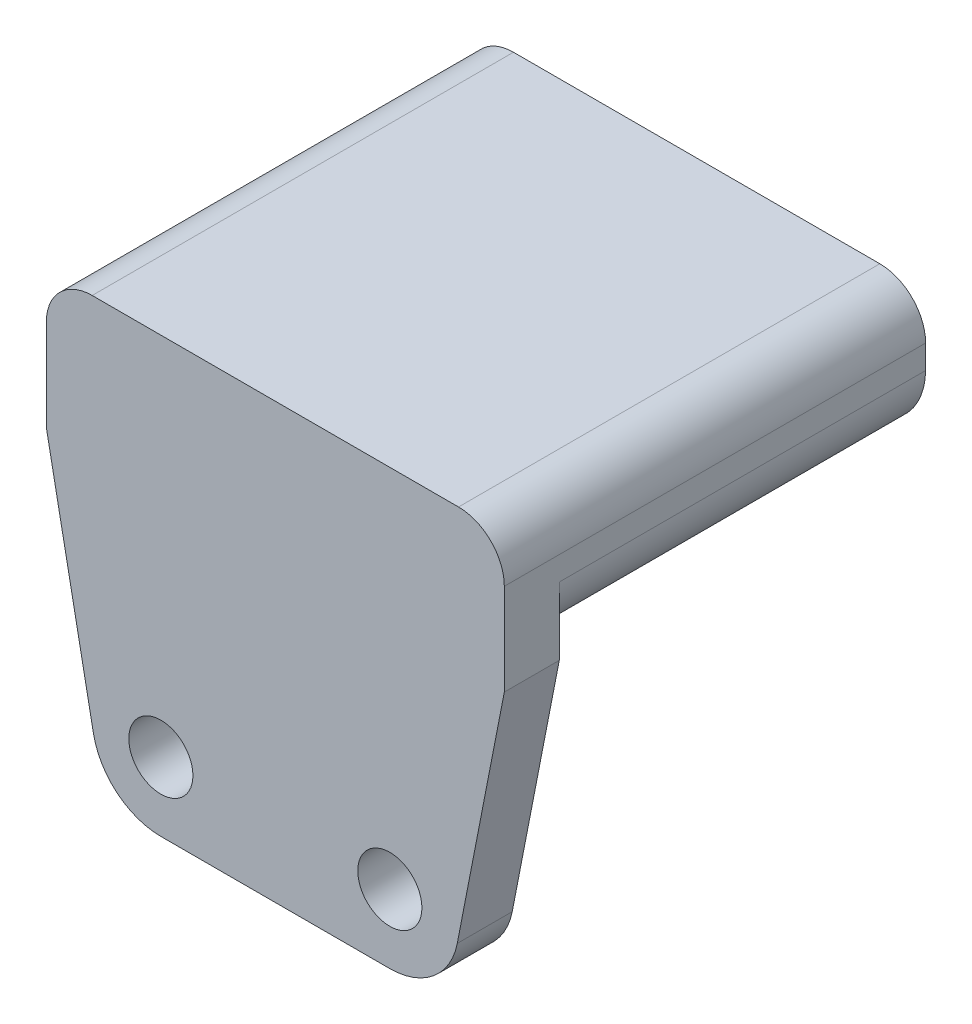
ISO-10303-21;
HEADER;
FILE_DESCRIPTION(('STEP AP214'),'2;1');
FILE_NAME('part.step','',(''),(''),'','','');
FILE_SCHEMA(('AUTOMOTIVE_DESIGN { 1 0 10303 214 1 1 1 1 }'));
ENDSEC;
DATA;
#1=APPLICATION_CONTEXT('core data for automotive mechanical design processes');
#2=APPLICATION_PROTOCOL_DEFINITION('international standard','automotive_design',2000,#1);
#3=PRODUCT_CONTEXT('',#1,'mechanical');
#4=PRODUCT('Part','Part','',(#3));
#5=PRODUCT_RELATED_PRODUCT_CATEGORY('part','',(#4));
#6=PRODUCT_DEFINITION_FORMATION('','',#4);
#7=PRODUCT_DEFINITION_CONTEXT('part definition',#1,'design');
#8=PRODUCT_DEFINITION('design','',#6,#7);
#9=PRODUCT_DEFINITION_SHAPE('','',#8);
#10=(LENGTH_UNIT() NAMED_UNIT(*) SI_UNIT(.MILLI.,.METRE.));
#11=(NAMED_UNIT(*) PLANE_ANGLE_UNIT() SI_UNIT($,.RADIAN.));
#12=(NAMED_UNIT(*) SI_UNIT($,.STERADIAN.) SOLID_ANGLE_UNIT());
#13=UNCERTAINTY_MEASURE_WITH_UNIT(LENGTH_MEASURE(1.E-05),#10,'distance_accuracy_value','');
#14=(GEOMETRIC_REPRESENTATION_CONTEXT(3) GLOBAL_UNCERTAINTY_ASSIGNED_CONTEXT((#13)) GLOBAL_UNIT_ASSIGNED_CONTEXT((#10,
#11,#12)) REPRESENTATION_CONTEXT('',''));
#15=CARTESIAN_POINT('',(0.,0.,0.));
#16=DIRECTION('',(0.,0.,1.));
#17=DIRECTION('',(1.,0.,0.));
#18=AXIS2_PLACEMENT_3D('',#15,#16,#17);
#19=CARTESIAN_POINT('',(0.,0.,0.));
#20=DIRECTION('',(0.,0.,1.));
#21=DIRECTION('',(1.,0.,0.));
#22=AXIS2_PLACEMENT_3D('',#19,#20,#21);
#23=PLANE('',#22);
#24=CARTESIAN_POINT('',(12.5,0.,0.));
#25=DIRECTION('',(0.,0.,1.));
#26=DIRECTION('',(1.,0.,0.));
#27=AXIS2_PLACEMENT_3D('',#24,#25,#26);
#28=CIRCLE('',#27,3.5);
#29=CARTESIAN_POINT('',(16.,0.,0.));
#30=VERTEX_POINT('',#29);
#31=EDGE_CURVE('E178',#30,#30,#28,.T.);
#32=ORIENTED_EDGE('',*,*,#31,.T.);
#33=EDGE_LOOP('',(#32));
#34=FACE_BOUND('',#33,.T.);
#35=CARTESIAN_POINT('',(-12.5,0.,0.));
#36=DIRECTION('',(0.,0.,1.));
#37=DIRECTION('',(1.,0.,0.));
#38=AXIS2_PLACEMENT_3D('',#35,#36,#37);
#39=CIRCLE('',#38,3.5);
#40=CARTESIAN_POINT('',(-9.,0.,0.));
#41=VERTEX_POINT('',#40);
#42=EDGE_CURVE('E175',#41,#41,#39,.T.);
#43=ORIENTED_EDGE('',*,*,#42,.T.);
#44=EDGE_LOOP('',(#43));
#45=FACE_BOUND('',#44,.T.);
#46=CARTESIAN_POINT('',(-17.5,32.4030394530778,0.));
#47=DIRECTION('',(0.,0.,1.));
#48=DIRECTION('',(1.,0.,0.));
#49=AXIS2_PLACEMENT_3D('',#46,#47,#48);
#50=CIRCLE('',#49,7.49999999999999);
#51=CARTESIAN_POINT('',(-17.5,24.9030394530778,0.));
#52=VERTEX_POINT('',#51);
#53=CARTESIAN_POINT('',(-25.,32.4030394530778,0.));
#54=VERTEX_POINT('',#53);
#55=EDGE_CURVE('E272',#52,#54,#50,.F.);
#56=ORIENTED_EDGE('',*,*,#55,.F.);
#57=DIRECTION('',(1.,0.,0.));
#58=VECTOR('',#57,1.);
#59=CARTESIAN_POINT('',(0.,24.9030394530778,0.));
#60=LINE('',#59,#58);
#61=CARTESIAN_POINT('',(17.5,24.9030394530778,0.));
#62=VERTEX_POINT('',#61);
#63=EDGE_CURVE('E274',#52,#62,#60,.T.);
#64=ORIENTED_EDGE('',*,*,#63,.T.);
#65=CARTESIAN_POINT('',(17.5006267830397,32.4030394268873,0.));
#66=DIRECTION('',(0.,0.,1.));
#67=DIRECTION('',(1.,0.,0.));
#68=AXIS2_PLACEMENT_3D('',#65,#66,#67);
#69=CIRCLE('',#68,7.5);
#70=CARTESIAN_POINT('',(25.,32.3060788537748,0.));
#71=VERTEX_POINT('',#70);
#72=EDGE_CURVE('E249',#62,#71,#69,.T.);
#73=ORIENTED_EDGE('',*,*,#72,.T.);
#74=DIRECTION('',(0.,1.,0.));
#75=VECTOR('',#74,1.);
#76=CARTESIAN_POINT('',(25.,0.,0.));
#77=LINE('',#76,#75);
#78=CARTESIAN_POINT('',(25.,24.9030394530778,0.));
#79=VERTEX_POINT('',#78);
#80=EDGE_CURVE('E173',#79,#71,#77,.T.);
#81=ORIENTED_EDGE('',*,*,#80,.F.);
#82=DIRECTION('',(-0.19148996451705,-0.981494571298924,0.));
#83=VECTOR('',#82,1.);
#84=CARTESIAN_POINT('',(19.4028542033577,-3.78550424177422,0.));
#85=LINE('',#84,#83);
#86=CARTESIAN_POINT('',(19.8612092847419,-1.43617473387787,0.));
#87=VERTEX_POINT('',#86);
#88=EDGE_CURVE('E170',#79,#87,#85,.T.);
#89=ORIENTED_EDGE('',*,*,#88,.T.);
#90=CARTESIAN_POINT('',(12.5,0.,0.));
#91=DIRECTION('',(0.,0.,1.));
#92=DIRECTION('',(1.,0.,0.));
#93=AXIS2_PLACEMENT_3D('',#90,#91,#92);
#94=CIRCLE('',#93,7.5);
#95=CARTESIAN_POINT('',(12.5,-7.5,0.));
#96=VERTEX_POINT('',#95);
#97=EDGE_CURVE('E167',#96,#87,#94,.T.);
#98=ORIENTED_EDGE('',*,*,#97,.F.);
#99=DIRECTION('',(1.,0.,0.));
#100=VECTOR('',#99,1.);
#101=CARTESIAN_POINT('',(0.,-7.5,0.));
#102=LINE('',#101,#100);
#103=CARTESIAN_POINT('',(-12.5,-7.5,0.));
#104=VERTEX_POINT('',#103);
#105=EDGE_CURVE('E165',#104,#96,#102,.T.);
#106=ORIENTED_EDGE('',*,*,#105,.F.);
#107=CARTESIAN_POINT('',(-12.5,0.,0.));
#108=DIRECTION('',(0.,0.,1.));
#109=DIRECTION('',(1.,0.,0.));
#110=AXIS2_PLACEMENT_3D('',#107,#108,#109);
#111=CIRCLE('',#110,7.5);
#112=CARTESIAN_POINT('',(-19.8612092847419,-1.43617473387787,0.));
#113=VERTEX_POINT('',#112);
#114=EDGE_CURVE('E163',#113,#104,#111,.T.);
#115=ORIENTED_EDGE('',*,*,#114,.F.);
#116=DIRECTION('',(0.19148996451705,-0.981494571298924,0.));
#117=VECTOR('',#116,1.);
#118=CARTESIAN_POINT('',(-19.4028542033577,-3.78550424177422,0.));
#119=LINE('',#118,#117);
#120=CARTESIAN_POINT('',(-25.,24.9030394530778,0.));
#121=VERTEX_POINT('',#120);
#122=EDGE_CURVE('E161',#121,#113,#119,.T.);
#123=ORIENTED_EDGE('',*,*,#122,.F.);
#124=DIRECTION('',(0.,1.,0.));
#125=VECTOR('',#124,1.);
#126=CARTESIAN_POINT('',(-25.,0.,0.));
#127=LINE('',#126,#125);
#128=EDGE_CURVE('E158',#121,#54,#127,.T.);
#129=ORIENTED_EDGE('',*,*,#128,.T.);
#130=EDGE_LOOP('',(#56,#64,#73,#81,#89,#98,#106,#115,#123,#129));
#131=FACE_BOUND('',#130,.T.);
#132=ADVANCED_FACE('F39',(#34,#45,#131),#23,.F.);
#133=CARTESIAN_POINT('',(-20.,34.9030394530778,6.));
#134=DIRECTION('',(0.,0.,-1.));
#135=DIRECTION('',(-1.,0.,0.));
#136=AXIS2_PLACEMENT_3D('',#133,#134,#135);
#137=CYLINDRICAL_SURFACE('',#136,5.);
#138=DIRECTION('',(0.,0.,-1.));
#139=VECTOR('',#138,1.);
#140=CARTESIAN_POINT('',(-20.,39.9030394530778,6.));
#141=LINE('',#140,#139);
#142=CARTESIAN_POINT('',(-20.,39.9030394530778,6.));
#143=VERTEX_POINT('',#142);
#144=CARTESIAN_POINT('',(-20.,39.9030394530778,-40.));
#145=VERTEX_POINT('',#144);
#146=EDGE_CURVE('E63',#143,#145,#141,.T.);
#147=ORIENTED_EDGE('',*,*,#146,.T.);
#148=CARTESIAN_POINT('',(-20.,34.9030394530778,-40.));
#149=DIRECTION('',(0.,0.,1.));
#150=DIRECTION('',(1.,0.,0.));
#151=AXIS2_PLACEMENT_3D('',#148,#149,#150);
#152=CIRCLE('',#151,5.);
#153=CARTESIAN_POINT('',(-25.,34.9030394530778,-40.));
#154=VERTEX_POINT('',#153);
#155=EDGE_CURVE('E276',#154,#145,#152,.F.);
#156=ORIENTED_EDGE('',*,*,#155,.F.);
#157=DIRECTION('',(0.,0.,-1.));
#158=VECTOR('',#157,1.);
#159=CARTESIAN_POINT('',(-25.,34.9030394530778,6.));
#160=LINE('',#159,#158);
#161=CARTESIAN_POINT('',(-25.,34.9030394530778,6.));
#162=VERTEX_POINT('',#161);
#163=EDGE_CURVE('E11',#162,#154,#160,.T.);
#164=ORIENTED_EDGE('',*,*,#163,.F.);
#165=CARTESIAN_POINT('',(-20.,34.9030394530778,6.));
#166=DIRECTION('',(0.,0.,1.));
#167=DIRECTION('',(1.,0.,0.));
#168=AXIS2_PLACEMENT_3D('',#165,#166,#167);
#169=CIRCLE('',#168,5.);
#170=EDGE_CURVE('E181',#162,#143,#169,.F.);
#171=ORIENTED_EDGE('',*,*,#170,.T.);
#172=EDGE_LOOP('',(#147,#156,#164,#171));
#173=FACE_BOUND('',#172,.T.);
#174=ADVANCED_FACE('F41',(#173),#137,.T.);
#175=CARTESIAN_POINT('',(-25.,0.,6.));
#176=DIRECTION('',(-1.,0.,0.));
#177=DIRECTION('',(0.,0.,1.));
#178=AXIS2_PLACEMENT_3D('',#175,#176,#177);
#179=PLANE('',#178);
#180=ORIENTED_EDGE('',*,*,#128,.F.);
#181=DIRECTION('',(0.,0.,-1.));
#182=VECTOR('',#181,1.);
#183=CARTESIAN_POINT('',(-25.,24.9030394530778,6.));
#184=LINE('',#183,#182);
#185=CARTESIAN_POINT('',(-25.,24.9030394530778,6.));
#186=VERTEX_POINT('',#185);
#187=EDGE_CURVE('E47',#186,#121,#184,.T.);
#188=ORIENTED_EDGE('',*,*,#187,.F.);
#189=DIRECTION('',(0.,1.,0.));
#190=VECTOR('',#189,1.);
#191=CARTESIAN_POINT('',(-25.,0.,6.));
#192=LINE('',#191,#190);
#193=EDGE_CURVE('E235',#186,#162,#192,.T.);
#194=ORIENTED_EDGE('',*,*,#193,.T.);
#195=ORIENTED_EDGE('',*,*,#163,.T.);
#196=DIRECTION('',(0.,1.,0.));
#197=VECTOR('',#196,1.);
#198=CARTESIAN_POINT('',(-25.,0.,-40.));
#199=LINE('',#198,#197);
#200=CARTESIAN_POINT('',(-25.,32.4030394530778,-40.));
#201=VERTEX_POINT('',#200);
#202=EDGE_CURVE('E217',#201,#154,#199,.T.);
#203=ORIENTED_EDGE('',*,*,#202,.F.);
#204=DIRECTION('',(0.,0.,1.));
#205=VECTOR('',#204,1.);
#206=CARTESIAN_POINT('',(-25.,32.4030394530778,-40.));
#207=LINE('',#206,#205);
#208=EDGE_CURVE('E214',#201,#54,#207,.T.);
#209=ORIENTED_EDGE('',*,*,#208,.T.);
#210=EDGE_LOOP('',(#180,#188,#194,#195,#203,#209));
#211=FACE_BOUND('',#210,.T.);
#212=ADVANCED_FACE('F211',(#211),#179,.T.);
#213=CARTESIAN_POINT('',(-19.4028542033577,-3.78550424177422,6.));
#214=DIRECTION('',(0.981494571298924,0.19148996451705,0.));
#215=DIRECTION('',(-0.19148996451705,0.981494571298924,0.));
#216=AXIS2_PLACEMENT_3D('',#213,#214,#215);
#217=PLANE('',#216);
#218=ORIENTED_EDGE('',*,*,#122,.T.);
#219=DIRECTION('',(0.,0.,-1.));
#220=VECTOR('',#219,1.);
#221=CARTESIAN_POINT('',(-19.8612092847419,-1.43617473387787,6.));
#222=LINE('',#221,#220);
#223=CARTESIAN_POINT('',(-19.8612092847419,-1.43617473387787,6.));
#224=VERTEX_POINT('',#223);
#225=EDGE_CURVE('E193',#224,#113,#222,.T.);
#226=ORIENTED_EDGE('',*,*,#225,.F.);
#227=DIRECTION('',(0.19148996451705,-0.981494571298924,0.));
#228=VECTOR('',#227,1.);
#229=CARTESIAN_POINT('',(-19.4028542033577,-3.78550424177422,6.));
#230=LINE('',#229,#228);
#231=EDGE_CURVE('E200',#186,#224,#230,.T.);
#232=ORIENTED_EDGE('',*,*,#231,.F.);
#233=ORIENTED_EDGE('',*,*,#187,.T.);
#234=EDGE_LOOP('',(#218,#226,#232,#233));
#235=FACE_BOUND('',#234,.T.);
#236=ADVANCED_FACE('F198',(#235),#217,.F.);
#237=CARTESIAN_POINT('',(-12.5,0.,6.));
#238=DIRECTION('',(0.,0.,-1.));
#239=DIRECTION('',(-1.,0.,0.));
#240=AXIS2_PLACEMENT_3D('',#237,#238,#239);
#241=CYLINDRICAL_SURFACE('',#240,7.5);
#242=ORIENTED_EDGE('',*,*,#114,.T.);
#243=DIRECTION('',(0.,0.,-1.));
#244=VECTOR('',#243,1.);
#245=CARTESIAN_POINT('',(-12.5,-7.5,6.));
#246=LINE('',#245,#244);
#247=CARTESIAN_POINT('',(-12.5,-7.5,6.));
#248=VERTEX_POINT('',#247);
#249=EDGE_CURVE('E190',#248,#104,#246,.T.);
#250=ORIENTED_EDGE('',*,*,#249,.F.);
#251=CARTESIAN_POINT('',(-12.5,0.,6.));
#252=DIRECTION('',(0.,0.,1.));
#253=DIRECTION('',(1.,0.,0.));
#254=AXIS2_PLACEMENT_3D('',#251,#252,#253);
#255=CIRCLE('',#254,7.5);
#256=EDGE_CURVE('E238',#224,#248,#255,.T.);
#257=ORIENTED_EDGE('',*,*,#256,.F.);
#258=ORIENTED_EDGE('',*,*,#225,.T.);
#259=EDGE_LOOP('',(#242,#250,#257,#258));
#260=FACE_BOUND('',#259,.T.);
#261=ADVANCED_FACE('F299',(#260),#241,.T.);
#262=CARTESIAN_POINT('',(0.,-7.5,6.));
#263=DIRECTION('',(0.,1.,0.));
#264=DIRECTION('',(0.,0.,1.));
#265=AXIS2_PLACEMENT_3D('',#262,#263,#264);
#266=PLANE('',#265);
#267=ORIENTED_EDGE('',*,*,#105,.T.);
#268=DIRECTION('',(0.,0.,-1.));
#269=VECTOR('',#268,1.);
#270=CARTESIAN_POINT('',(12.5,-7.5,6.));
#271=LINE('',#270,#269);
#272=CARTESIAN_POINT('',(12.5,-7.5,6.));
#273=VERTEX_POINT('',#272);
#274=EDGE_CURVE('E187',#273,#96,#271,.T.);
#275=ORIENTED_EDGE('',*,*,#274,.F.);
#276=DIRECTION('',(1.,0.,0.));
#277=VECTOR('',#276,1.);
#278=CARTESIAN_POINT('',(0.,-7.5,6.));
#279=LINE('',#278,#277);
#280=EDGE_CURVE('E240',#248,#273,#279,.T.);
#281=ORIENTED_EDGE('',*,*,#280,.F.);
#282=ORIENTED_EDGE('',*,*,#249,.T.);
#283=EDGE_LOOP('',(#267,#275,#281,#282));
#284=FACE_BOUND('',#283,.T.);
#285=ADVANCED_FACE('F303',(#284),#266,.F.);
#286=CARTESIAN_POINT('',(12.5,0.,6.));
#287=DIRECTION('',(0.,0.,-1.));
#288=DIRECTION('',(-1.,0.,0.));
#289=AXIS2_PLACEMENT_3D('',#286,#287,#288);
#290=CYLINDRICAL_SURFACE('',#289,7.5);
#291=ORIENTED_EDGE('',*,*,#97,.T.);
#292=DIRECTION('',(0.,0.,-1.));
#293=VECTOR('',#292,1.);
#294=CARTESIAN_POINT('',(19.8612092847419,-1.43617473387787,6.));
#295=LINE('',#294,#293);
#296=CARTESIAN_POINT('',(19.8612092847419,-1.43617473387787,6.));
#297=VERTEX_POINT('',#296);
#298=EDGE_CURVE('E185',#297,#87,#295,.T.);
#299=ORIENTED_EDGE('',*,*,#298,.F.);
#300=CARTESIAN_POINT('',(12.5,0.,6.));
#301=DIRECTION('',(0.,0.,1.));
#302=DIRECTION('',(1.,0.,0.));
#303=AXIS2_PLACEMENT_3D('',#300,#301,#302);
#304=CIRCLE('',#303,7.5);
#305=EDGE_CURVE('E242',#273,#297,#304,.T.);
#306=ORIENTED_EDGE('',*,*,#305,.F.);
#307=ORIENTED_EDGE('',*,*,#274,.T.);
#308=EDGE_LOOP('',(#291,#299,#306,#307));
#309=FACE_BOUND('',#308,.T.);
#310=ADVANCED_FACE('F306',(#309),#290,.T.);
#311=CARTESIAN_POINT('',(19.4028542033577,-3.78550424177422,6.));
#312=DIRECTION('',(0.981494571298924,-0.19148996451705,0.));
#313=DIRECTION('',(0.19148996451705,0.981494571298924,0.));
#314=AXIS2_PLACEMENT_3D('',#311,#312,#313);
#315=PLANE('',#314);
#316=ORIENTED_EDGE('',*,*,#88,.F.);
#317=DIRECTION('',(0.,0.,-1.));
#318=VECTOR('',#317,1.);
#319=CARTESIAN_POINT('',(25.,24.9030394530778,6.));
#320=LINE('',#319,#318);
#321=CARTESIAN_POINT('',(25.,24.9030394530778,6.));
#322=VERTEX_POINT('',#321);
#323=EDGE_CURVE('E92',#322,#79,#320,.T.);
#324=ORIENTED_EDGE('',*,*,#323,.F.);
#325=DIRECTION('',(-0.19148996451705,-0.981494571298924,0.));
#326=VECTOR('',#325,1.);
#327=CARTESIAN_POINT('',(19.4028542033577,-3.78550424177422,6.));
#328=LINE('',#327,#326);
#329=EDGE_CURVE('E131',#322,#297,#328,.T.);
#330=ORIENTED_EDGE('',*,*,#329,.T.);
#331=ORIENTED_EDGE('',*,*,#298,.T.);
#332=EDGE_LOOP('',(#316,#324,#330,#331));
#333=FACE_BOUND('',#332,.T.);
#334=ADVANCED_FACE('F245',(#333),#315,.T.);
#335=CARTESIAN_POINT('',(25.,0.,6.));
#336=DIRECTION('',(-1.,0.,0.));
#337=DIRECTION('',(0.,0.,1.));
#338=AXIS2_PLACEMENT_3D('',#335,#336,#337);
#339=PLANE('',#338);
#340=ORIENTED_EDGE('',*,*,#80,.T.);
#341=DIRECTION('',(0.,0.,1.));
#342=VECTOR('',#341,1.);
#343=CARTESIAN_POINT('',(25.,32.3060788537748,-40.));
#344=LINE('',#343,#342);
#345=CARTESIAN_POINT('',(25.,32.3060788537748,-40.));
#346=VERTEX_POINT('',#345);
#347=EDGE_CURVE('E54',#346,#71,#344,.T.);
#348=ORIENTED_EDGE('',*,*,#347,.F.);
#349=DIRECTION('',(0.,1.,0.));
#350=VECTOR('',#349,1.);
#351=CARTESIAN_POINT('',(25.,0.,-40.));
#352=LINE('',#351,#350);
#353=CARTESIAN_POINT('',(25.,34.9030394530778,-40.));
#354=VERTEX_POINT('',#353);
#355=EDGE_CURVE('E139',#346,#354,#352,.T.);
#356=ORIENTED_EDGE('',*,*,#355,.T.);
#357=DIRECTION('',(0.,0.,-1.));
#358=VECTOR('',#357,1.);
#359=CARTESIAN_POINT('',(25.,34.9030394530778,6.));
#360=LINE('',#359,#358);
#361=CARTESIAN_POINT('',(25.,34.9030394530778,6.));
#362=VERTEX_POINT('',#361);
#363=EDGE_CURVE('E135',#362,#354,#360,.T.);
#364=ORIENTED_EDGE('',*,*,#363,.F.);
#365=DIRECTION('',(0.,1.,0.));
#366=VECTOR('',#365,1.);
#367=CARTESIAN_POINT('',(25.,0.,6.));
#368=LINE('',#367,#366);
#369=EDGE_CURVE('E123',#322,#362,#368,.T.);
#370=ORIENTED_EDGE('',*,*,#369,.F.);
#371=ORIENTED_EDGE('',*,*,#323,.T.);
#372=EDGE_LOOP('',(#340,#348,#356,#364,#370,#371));
#373=FACE_BOUND('',#372,.T.);
#374=ADVANCED_FACE('F136',(#373),#339,.F.);
#375=CARTESIAN_POINT('',(20.,34.9030394530778,6.));
#376=DIRECTION('',(0.,0.,-1.));
#377=DIRECTION('',(-1.,0.,0.));
#378=AXIS2_PLACEMENT_3D('',#375,#376,#377);
#379=CYLINDRICAL_SURFACE('',#378,5.);
#380=ORIENTED_EDGE('',*,*,#363,.T.);
#381=CARTESIAN_POINT('',(20.,34.9030394530778,-40.));
#382=DIRECTION('',(0.,0.,1.));
#383=DIRECTION('',(1.,0.,0.));
#384=AXIS2_PLACEMENT_3D('',#381,#382,#383);
#385=CIRCLE('',#384,5.);
#386=CARTESIAN_POINT('',(20.,39.9030394530778,-40.));
#387=VERTEX_POINT('',#386);
#388=EDGE_CURVE('E230',#387,#354,#385,.F.);
#389=ORIENTED_EDGE('',*,*,#388,.F.);
#390=DIRECTION('',(0.,0.,-1.));
#391=VECTOR('',#390,1.);
#392=CARTESIAN_POINT('',(20.,39.9030394530778,6.));
#393=LINE('',#392,#391);
#394=CARTESIAN_POINT('',(20.,39.9030394530778,6.));
#395=VERTEX_POINT('',#394);
#396=EDGE_CURVE('E143',#395,#387,#393,.T.);
#397=ORIENTED_EDGE('',*,*,#396,.F.);
#398=CARTESIAN_POINT('',(20.,34.9030394530778,6.));
#399=DIRECTION('',(0.,0.,1.));
#400=DIRECTION('',(1.,0.,0.));
#401=AXIS2_PLACEMENT_3D('',#398,#399,#400);
#402=CIRCLE('',#401,5.);
#403=EDGE_CURVE('E129',#395,#362,#402,.F.);
#404=ORIENTED_EDGE('',*,*,#403,.T.);
#405=EDGE_LOOP('',(#380,#389,#397,#404));
#406=FACE_BOUND('',#405,.T.);
#407=ADVANCED_FACE('F145',(#406),#379,.T.);
#408=CARTESIAN_POINT('',(-12.5,0.,6.));
#409=DIRECTION('',(0.,0.,-1.));
#410=DIRECTION('',(-1.,0.,0.));
#411=AXIS2_PLACEMENT_3D('',#408,#409,#410);
#412=CYLINDRICAL_SURFACE('',#411,3.5);
#413=CARTESIAN_POINT('',(-12.5,0.,6.));
#414=DIRECTION('',(0.,0.,1.));
#415=DIRECTION('',(1.,0.,0.));
#416=AXIS2_PLACEMENT_3D('',#413,#414,#415);
#417=CIRCLE('',#416,3.5);
#418=CARTESIAN_POINT('',(-9.,0.,6.));
#419=VERTEX_POINT('',#418);
#420=EDGE_CURVE('E149',#419,#419,#417,.T.);
#421=ORIENTED_EDGE('',*,*,#420,.T.);
#422=EDGE_LOOP('',(#421));
#423=FACE_BOUND('',#422,.T.);
#424=ORIENTED_EDGE('',*,*,#42,.F.);
#425=EDGE_LOOP('',(#424));
#426=FACE_BOUND('',#425,.T.);
#427=ADVANCED_FACE('F330',(#423,#426),#412,.F.);
#428=CARTESIAN_POINT('',(0.,39.9030394530778,6.));
#429=DIRECTION('',(0.,1.,0.));
#430=DIRECTION('',(0.,0.,1.));
#431=AXIS2_PLACEMENT_3D('',#428,#429,#430);
#432=PLANE('',#431);
#433=ORIENTED_EDGE('',*,*,#396,.T.);
#434=DIRECTION('',(1.,0.,0.));
#435=VECTOR('',#434,1.);
#436=CARTESIAN_POINT('',(0.,39.9030394530778,-40.));
#437=LINE('',#436,#435);
#438=EDGE_CURVE('E224',#145,#387,#437,.T.);
#439=ORIENTED_EDGE('',*,*,#438,.F.);
#440=ORIENTED_EDGE('',*,*,#146,.F.);
#441=DIRECTION('',(1.,0.,0.));
#442=VECTOR('',#441,1.);
#443=CARTESIAN_POINT('',(0.,39.9030394530778,6.));
#444=LINE('',#443,#442);
#445=EDGE_CURVE('E147',#143,#395,#444,.T.);
#446=ORIENTED_EDGE('',*,*,#445,.T.);
#447=EDGE_LOOP('',(#433,#439,#440,#446));
#448=FACE_BOUND('',#447,.T.);
#449=ADVANCED_FACE('F293',(#448),#432,.T.);
#450=CARTESIAN_POINT('',(12.5,0.,6.));
#451=DIRECTION('',(0.,0.,-1.));
#452=DIRECTION('',(-1.,0.,0.));
#453=AXIS2_PLACEMENT_3D('',#450,#451,#452);
#454=CYLINDRICAL_SURFACE('',#453,3.5);
#455=CARTESIAN_POINT('',(12.5,0.,6.));
#456=DIRECTION('',(0.,0.,1.));
#457=DIRECTION('',(1.,0.,0.));
#458=AXIS2_PLACEMENT_3D('',#455,#456,#457);
#459=CIRCLE('',#458,3.5);
#460=CARTESIAN_POINT('',(16.,0.,6.));
#461=VERTEX_POINT('',#460);
#462=EDGE_CURVE('E155',#461,#461,#459,.T.);
#463=ORIENTED_EDGE('',*,*,#462,.T.);
#464=EDGE_LOOP('',(#463));
#465=FACE_BOUND('',#464,.T.);
#466=ORIENTED_EDGE('',*,*,#31,.F.);
#467=EDGE_LOOP('',(#466));
#468=FACE_BOUND('',#467,.T.);
#469=ADVANCED_FACE('F326',(#465,#468),#454,.F.);
#470=CARTESIAN_POINT('',(0.,0.,6.));
#471=DIRECTION('',(0.,0.,1.));
#472=DIRECTION('',(1.,0.,0.));
#473=AXIS2_PLACEMENT_3D('',#470,#471,#472);
#474=PLANE('',#473);
#475=ORIENTED_EDGE('',*,*,#170,.F.);
#476=ORIENTED_EDGE('',*,*,#193,.F.);
#477=ORIENTED_EDGE('',*,*,#231,.T.);
#478=ORIENTED_EDGE('',*,*,#256,.T.);
#479=ORIENTED_EDGE('',*,*,#280,.T.);
#480=ORIENTED_EDGE('',*,*,#305,.T.);
#481=ORIENTED_EDGE('',*,*,#329,.F.);
#482=ORIENTED_EDGE('',*,*,#369,.T.);
#483=ORIENTED_EDGE('',*,*,#403,.F.);
#484=ORIENTED_EDGE('',*,*,#445,.F.);
#485=EDGE_LOOP('',(#475,#476,#477,#478,#479,#480,#481,#482,#483,#484));
#486=FACE_BOUND('',#485,.T.);
#487=ORIENTED_EDGE('',*,*,#420,.F.);
#488=EDGE_LOOP('',(#487));
#489=FACE_BOUND('',#488,.T.);
#490=ORIENTED_EDGE('',*,*,#462,.F.);
#491=EDGE_LOOP('',(#490));
#492=FACE_BOUND('',#491,.T.);
#493=ADVANCED_FACE('F125',(#486,#489,#492),#474,.T.);
#494=CARTESIAN_POINT('',(17.5006267830397,32.4030394268873,-40.));
#495=DIRECTION('',(0.,0.,1.));
#496=DIRECTION('',(1.,0.,0.));
#497=AXIS2_PLACEMENT_3D('',#494,#495,#496);
#498=CYLINDRICAL_SURFACE('',#497,7.5);
#499=ORIENTED_EDGE('',*,*,#72,.F.);
#500=DIRECTION('',(0.,0.,1.));
#501=VECTOR('',#500,1.);
#502=CARTESIAN_POINT('',(17.5,24.9030394530778,-40.));
#503=LINE('',#502,#501);
#504=CARTESIAN_POINT('',(17.5,24.9030394530778,-40.));
#505=VERTEX_POINT('',#504);
#506=EDGE_CURVE('E227',#505,#62,#503,.T.);
#507=ORIENTED_EDGE('',*,*,#506,.F.);
#508=CARTESIAN_POINT('',(17.5006267830397,32.4030394268873,-40.));
#509=DIRECTION('',(0.,0.,1.));
#510=DIRECTION('',(1.,0.,0.));
#511=AXIS2_PLACEMENT_3D('',#508,#509,#510);
#512=CIRCLE('',#511,7.5);
#513=EDGE_CURVE('E259',#505,#346,#512,.T.);
#514=ORIENTED_EDGE('',*,*,#513,.T.);
#515=ORIENTED_EDGE('',*,*,#347,.T.);
#516=EDGE_LOOP('',(#499,#507,#514,#515));
#517=FACE_BOUND('',#516,.T.);
#518=ADVANCED_FACE('F263',(#517),#498,.T.);
#519=CARTESIAN_POINT('',(0.,24.9030394530778,-40.));
#520=DIRECTION('',(0.,-1.,0.));
#521=DIRECTION('',(0.,0.,-1.));
#522=AXIS2_PLACEMENT_3D('',#519,#520,#521);
#523=PLANE('',#522);
#524=ORIENTED_EDGE('',*,*,#63,.F.);
#525=DIRECTION('',(0.,0.,1.));
#526=VECTOR('',#525,1.);
#527=CARTESIAN_POINT('',(-17.5,24.9030394530778,-40.));
#528=LINE('',#527,#526);
#529=CARTESIAN_POINT('',(-17.5,24.9030394530778,-40.));
#530=VERTEX_POINT('',#529);
#531=EDGE_CURVE('E223',#530,#52,#528,.T.);
#532=ORIENTED_EDGE('',*,*,#531,.F.);
#533=DIRECTION('',(1.,0.,0.));
#534=VECTOR('',#533,1.);
#535=CARTESIAN_POINT('',(0.,24.9030394530778,-40.));
#536=LINE('',#535,#534);
#537=EDGE_CURVE('E265',#530,#505,#536,.T.);
#538=ORIENTED_EDGE('',*,*,#537,.T.);
#539=ORIENTED_EDGE('',*,*,#506,.T.);
#540=EDGE_LOOP('',(#524,#532,#538,#539));
#541=FACE_BOUND('',#540,.T.);
#542=ADVANCED_FACE('F279',(#541),#523,.T.);
#543=CARTESIAN_POINT('',(-17.5,32.4030394530778,-40.));
#544=DIRECTION('',(0.,0.,1.));
#545=DIRECTION('',(1.,0.,0.));
#546=AXIS2_PLACEMENT_3D('',#543,#544,#545);
#547=CYLINDRICAL_SURFACE('',#546,7.49999999999999);
#548=ORIENTED_EDGE('',*,*,#55,.T.);
#549=ORIENTED_EDGE('',*,*,#208,.F.);
#550=CARTESIAN_POINT('',(-17.5,32.4030394530778,-40.));
#551=DIRECTION('',(0.,0.,1.));
#552=DIRECTION('',(1.,0.,0.));
#553=AXIS2_PLACEMENT_3D('',#550,#551,#552);
#554=CIRCLE('',#553,7.49999999999999);
#555=EDGE_CURVE('E267',#530,#201,#554,.F.);
#556=ORIENTED_EDGE('',*,*,#555,.F.);
#557=ORIENTED_EDGE('',*,*,#531,.T.);
#558=EDGE_LOOP('',(#548,#549,#556,#557));
#559=FACE_BOUND('',#558,.T.);
#560=ADVANCED_FACE('F282',(#559),#547,.T.);
#561=CARTESIAN_POINT('',(0.,0.,-40.));
#562=DIRECTION('',(0.,0.,1.));
#563=DIRECTION('',(1.,0.,0.));
#564=AXIS2_PLACEMENT_3D('',#561,#562,#563);
#565=PLANE('',#564);
#566=ORIENTED_EDGE('',*,*,#155,.T.);
#567=ORIENTED_EDGE('',*,*,#438,.T.);
#568=ORIENTED_EDGE('',*,*,#388,.T.);
#569=ORIENTED_EDGE('',*,*,#355,.F.);
#570=ORIENTED_EDGE('',*,*,#513,.F.);
#571=ORIENTED_EDGE('',*,*,#537,.F.);
#572=ORIENTED_EDGE('',*,*,#555,.T.);
#573=ORIENTED_EDGE('',*,*,#202,.T.);
#574=EDGE_LOOP('',(#566,#567,#568,#569,#570,#571,#572,#573));
#575=FACE_BOUND('',#574,.T.);
#576=ADVANCED_FACE('F257',(#575),#565,.F.);
#577=CLOSED_SHELL('',(#132,#174,#212,#236,#261,#285,#310,#334,#374,#407,#427,#449,#469,#493,
#518,#542,#560,#576));
#578=MANIFOLD_SOLID_BREP('B2',#577);
#579=ADVANCED_BREP_SHAPE_REPRESENTATION('',(#18,#578),#14);
#580=SHAPE_DEFINITION_REPRESENTATION(#9,#579);
ENDSEC;
END-ISO-10303-21;
